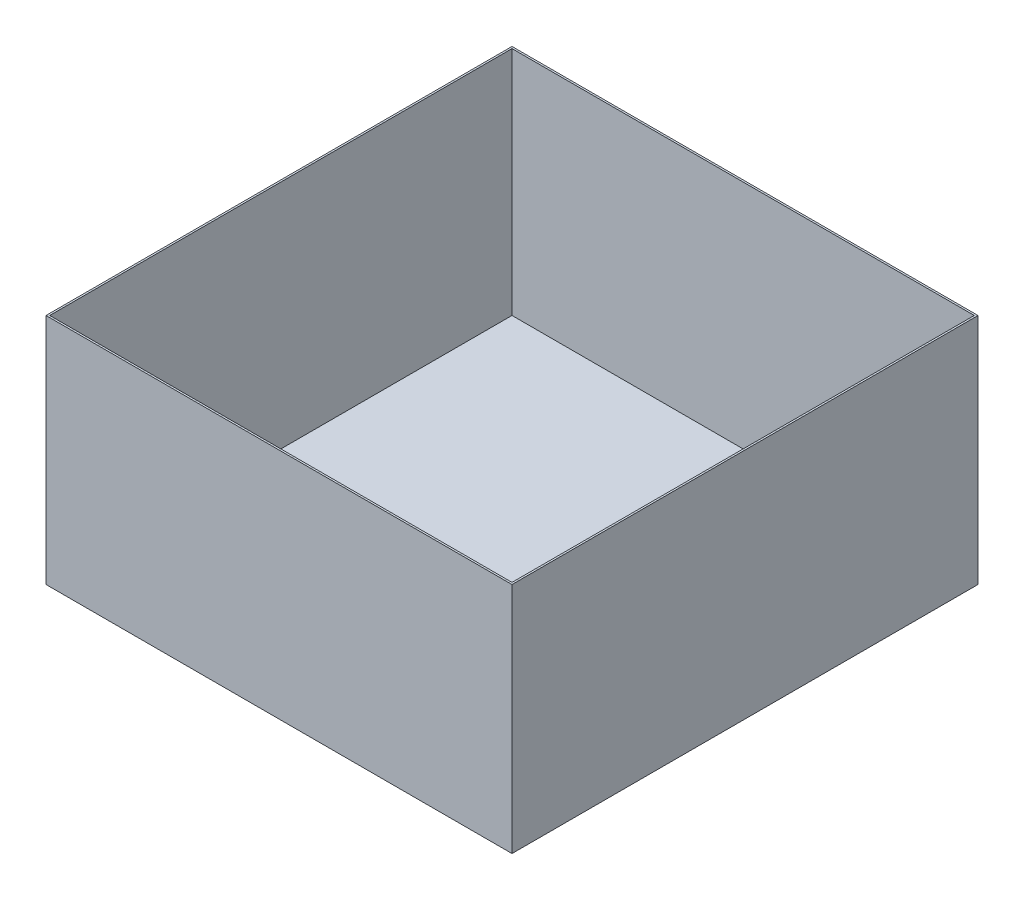
ISO-10303-21;
HEADER;
FILE_DESCRIPTION(('STEP AP214'),'2;1');
FILE_NAME('part.step','',(''),(''),'','','');
FILE_SCHEMA(('AUTOMOTIVE_DESIGN { 1 0 10303 214 1 1 1 1 }'));
ENDSEC;
DATA;
#1=APPLICATION_CONTEXT('core data for automotive mechanical design processes');
#2=APPLICATION_PROTOCOL_DEFINITION('international standard','automotive_design',2000,#1);
#3=PRODUCT_CONTEXT('',#1,'mechanical');
#4=PRODUCT('Part','Part','',(#3));
#5=PRODUCT_RELATED_PRODUCT_CATEGORY('part','',(#4));
#6=PRODUCT_DEFINITION_FORMATION('','',#4);
#7=PRODUCT_DEFINITION_CONTEXT('part definition',#1,'design');
#8=PRODUCT_DEFINITION('design','',#6,#7);
#9=PRODUCT_DEFINITION_SHAPE('','',#8);
#10=(LENGTH_UNIT() NAMED_UNIT(*) SI_UNIT(.MILLI.,.METRE.));
#11=(NAMED_UNIT(*) PLANE_ANGLE_UNIT() SI_UNIT($,.RADIAN.));
#12=(NAMED_UNIT(*) SI_UNIT($,.STERADIAN.) SOLID_ANGLE_UNIT());
#13=UNCERTAINTY_MEASURE_WITH_UNIT(LENGTH_MEASURE(1.E-05),#10,'distance_accuracy_value','');
#14=(GEOMETRIC_REPRESENTATION_CONTEXT(3) GLOBAL_UNCERTAINTY_ASSIGNED_CONTEXT((#13)) GLOBAL_UNIT_ASSIGNED_CONTEXT((#10,
#11,#12)) REPRESENTATION_CONTEXT('',''));
#15=CARTESIAN_POINT('',(0.,0.,0.));
#16=DIRECTION('',(0.,0.,1.));
#17=DIRECTION('',(1.,0.,0.));
#18=AXIS2_PLACEMENT_3D('',#15,#16,#17);
#19=CARTESIAN_POINT('',(0.,-250.,0.));
#20=DIRECTION('',(1.,0.,0.));
#21=DIRECTION('',(0.,0.,-1.));
#22=AXIS2_PLACEMENT_3D('',#19,#20,#21);
#23=PLANE('',#22);
#24=DIRECTION('',(0.,0.,-1.));
#25=VECTOR('',#24,1.);
#26=CARTESIAN_POINT('',(0.,0.,0.));
#27=LINE('',#26,#25);
#28=CARTESIAN_POINT('',(0.,0.,0.));
#29=VERTEX_POINT('',#28);
#30=CARTESIAN_POINT('',(0.,0.,-500.));
#31=VERTEX_POINT('',#30);
#32=EDGE_CURVE('E169',#29,#31,#27,.T.);
#33=ORIENTED_EDGE('',*,*,#32,.T.);
#34=DIRECTION('',(0.,1.,0.));
#35=VECTOR('',#34,1.);
#36=CARTESIAN_POINT('',(0.,-250.,-500.));
#37=LINE('',#36,#35);
#38=CARTESIAN_POINT('',(0.,-250.,-500.));
#39=VERTEX_POINT('',#38);
#40=EDGE_CURVE('E11',#39,#31,#37,.T.);
#41=ORIENTED_EDGE('',*,*,#40,.F.);
#42=DIRECTION('',(0.,0.,-1.));
#43=VECTOR('',#42,1.);
#44=CARTESIAN_POINT('',(0.,-250.,0.));
#45=LINE('',#44,#43);
#46=CARTESIAN_POINT('',(0.,-250.,0.));
#47=VERTEX_POINT('',#46);
#48=EDGE_CURVE('E156',#47,#39,#45,.T.);
#49=ORIENTED_EDGE('',*,*,#48,.F.);
#50=DIRECTION('',(0.,1.,0.));
#51=VECTOR('',#50,1.);
#52=CARTESIAN_POINT('',(0.,-250.,0.));
#53=LINE('',#52,#51);
#54=EDGE_CURVE('E63',#47,#29,#53,.T.);
#55=ORIENTED_EDGE('',*,*,#54,.T.);
#56=EDGE_LOOP('',(#33,#41,#49,#55));
#57=FACE_BOUND('',#56,.T.);
#58=ADVANCED_FACE('F39',(#57),#23,.F.);
#59=CARTESIAN_POINT('',(0.,-250.,-500.));
#60=DIRECTION('',(0.,0.,1.));
#61=DIRECTION('',(1.,0.,0.));
#62=AXIS2_PLACEMENT_3D('',#59,#60,#61);
#63=PLANE('',#62);
#64=DIRECTION('',(1.,0.,0.));
#65=VECTOR('',#64,1.);
#66=CARTESIAN_POINT('',(0.,0.,-500.));
#67=LINE('',#66,#65);
#68=CARTESIAN_POINT('',(500.,0.,-500.));
#69=VERTEX_POINT('',#68);
#70=EDGE_CURVE('E172',#31,#69,#67,.T.);
#71=ORIENTED_EDGE('',*,*,#70,.T.);
#72=DIRECTION('',(0.,1.,0.));
#73=VECTOR('',#72,1.);
#74=CARTESIAN_POINT('',(500.,-250.,-500.));
#75=LINE('',#74,#73);
#76=CARTESIAN_POINT('',(500.,-250.,-500.));
#77=VERTEX_POINT('',#76);
#78=EDGE_CURVE('E47',#77,#69,#75,.T.);
#79=ORIENTED_EDGE('',*,*,#78,.F.);
#80=DIRECTION('',(1.,0.,0.));
#81=VECTOR('',#80,1.);
#82=CARTESIAN_POINT('',(0.,-250.,-500.));
#83=LINE('',#82,#81);
#84=EDGE_CURVE('E89',#39,#77,#83,.T.);
#85=ORIENTED_EDGE('',*,*,#84,.F.);
#86=ORIENTED_EDGE('',*,*,#40,.T.);
#87=EDGE_LOOP('',(#71,#79,#85,#86));
#88=FACE_BOUND('',#87,.T.);
#89=ADVANCED_FACE('F193',(#88),#63,.F.);
#90=CARTESIAN_POINT('',(500.,-250.,0.));
#91=DIRECTION('',(1.,0.,0.));
#92=DIRECTION('',(0.,0.,-1.));
#93=AXIS2_PLACEMENT_3D('',#90,#91,#92);
#94=PLANE('',#93);
#95=DIRECTION('',(0.,0.,-1.));
#96=VECTOR('',#95,1.);
#97=CARTESIAN_POINT('',(500.,0.,0.));
#98=LINE('',#97,#96);
#99=CARTESIAN_POINT('',(500.,0.,0.));
#100=VERTEX_POINT('',#99);
#101=EDGE_CURVE('E177',#100,#69,#98,.T.);
#102=ORIENTED_EDGE('',*,*,#101,.F.);
#103=DIRECTION('',(0.,1.,0.));
#104=VECTOR('',#103,1.);
#105=CARTESIAN_POINT('',(500.,-250.,0.));
#106=LINE('',#105,#104);
#107=CARTESIAN_POINT('',(500.,-250.,0.));
#108=VERTEX_POINT('',#107);
#109=EDGE_CURVE('E186',#108,#100,#106,.T.);
#110=ORIENTED_EDGE('',*,*,#109,.F.);
#111=DIRECTION('',(0.,0.,-1.));
#112=VECTOR('',#111,1.);
#113=CARTESIAN_POINT('',(500.,-250.,0.));
#114=LINE('',#113,#112);
#115=EDGE_CURVE('E162',#108,#77,#114,.T.);
#116=ORIENTED_EDGE('',*,*,#115,.T.);
#117=ORIENTED_EDGE('',*,*,#78,.T.);
#118=EDGE_LOOP('',(#102,#110,#116,#117));
#119=FACE_BOUND('',#118,.T.);
#120=ADVANCED_FACE('F191',(#119),#94,.T.);
#121=CARTESIAN_POINT('',(0.,-250.,0.));
#122=DIRECTION('',(0.,0.,1.));
#123=DIRECTION('',(1.,0.,0.));
#124=AXIS2_PLACEMENT_3D('',#121,#122,#123);
#125=PLANE('',#124);
#126=DIRECTION('',(1.,0.,0.));
#127=VECTOR('',#126,1.);
#128=CARTESIAN_POINT('',(0.,0.,0.));
#129=LINE('',#128,#127);
#130=EDGE_CURVE('E159',#29,#100,#129,.T.);
#131=ORIENTED_EDGE('',*,*,#130,.F.);
#132=ORIENTED_EDGE('',*,*,#54,.F.);
#133=DIRECTION('',(1.,0.,0.));
#134=VECTOR('',#133,1.);
#135=CARTESIAN_POINT('',(0.,-250.,0.));
#136=LINE('',#135,#134);
#137=EDGE_CURVE('E166',#47,#108,#136,.T.);
#138=ORIENTED_EDGE('',*,*,#137,.T.);
#139=ORIENTED_EDGE('',*,*,#109,.T.);
#140=EDGE_LOOP('',(#131,#132,#138,#139));
#141=FACE_BOUND('',#140,.T.);
#142=ADVANCED_FACE('F197',(#141),#125,.T.);
#143=CARTESIAN_POINT('',(0.,-250.,0.));
#144=DIRECTION('',(0.,-1.,0.));
#145=DIRECTION('',(0.,0.,-1.));
#146=AXIS2_PLACEMENT_3D('',#143,#144,#145);
#147=PLANE('',#146);
#148=ORIENTED_EDGE('',*,*,#48,.T.);
#149=ORIENTED_EDGE('',*,*,#84,.T.);
#150=ORIENTED_EDGE('',*,*,#115,.F.);
#151=ORIENTED_EDGE('',*,*,#137,.F.);
#152=EDGE_LOOP('',(#148,#149,#150,#151));
#153=FACE_BOUND('',#152,.T.);
#154=ADVANCED_FACE('F200',(#153),#147,.T.);
#155=CARTESIAN_POINT('',(0.,0.,0.));
#156=DIRECTION('',(0.,-1.,0.));
#157=DIRECTION('',(0.,0.,-1.));
#158=AXIS2_PLACEMENT_3D('',#155,#156,#157);
#159=PLANE('',#158);
#160=DIRECTION('',(1.,0.,0.));
#161=VECTOR('',#160,1.);
#162=CARTESIAN_POINT('',(0.,0.,-2.));
#163=LINE('',#162,#161);
#164=CARTESIAN_POINT('',(2.,0.,-2.));
#165=VERTEX_POINT('',#164);
#166=CARTESIAN_POINT('',(498.,0.,-2.));
#167=VERTEX_POINT('',#166);
#168=EDGE_CURVE('E135',#165,#167,#163,.T.);
#169=ORIENTED_EDGE('',*,*,#168,.F.);
#170=DIRECTION('',(0.,0.,-1.));
#171=VECTOR('',#170,1.);
#172=CARTESIAN_POINT('',(2.,0.,0.));
#173=LINE('',#172,#171);
#174=CARTESIAN_POINT('',(2.,0.,-498.));
#175=VERTEX_POINT('',#174);
#176=EDGE_CURVE('E120',#165,#175,#173,.T.);
#177=ORIENTED_EDGE('',*,*,#176,.T.);
#178=DIRECTION('',(1.,0.,0.));
#179=VECTOR('',#178,1.);
#180=CARTESIAN_POINT('',(0.,0.,-498.));
#181=LINE('',#180,#179);
#182=CARTESIAN_POINT('',(498.,0.,-498.));
#183=VERTEX_POINT('',#182);
#184=EDGE_CURVE('E148',#175,#183,#181,.T.);
#185=ORIENTED_EDGE('',*,*,#184,.T.);
#186=DIRECTION('',(0.,0.,-1.));
#187=VECTOR('',#186,1.);
#188=CARTESIAN_POINT('',(498.,0.,0.));
#189=LINE('',#188,#187);
#190=EDGE_CURVE('E54',#167,#183,#189,.T.);
#191=ORIENTED_EDGE('',*,*,#190,.F.);
#192=EDGE_LOOP('',(#169,#177,#185,#191));
#193=FACE_BOUND('',#192,.T.);
#194=ORIENTED_EDGE('',*,*,#32,.F.);
#195=ORIENTED_EDGE('',*,*,#130,.T.);
#196=ORIENTED_EDGE('',*,*,#101,.T.);
#197=ORIENTED_EDGE('',*,*,#70,.F.);
#198=EDGE_LOOP('',(#194,#195,#196,#197));
#199=FACE_BOUND('',#198,.T.);
#200=ADVANCED_FACE('F196',(#193,#199),#159,.F.);
#201=CARTESIAN_POINT('',(2.,-250.,0.));
#202=DIRECTION('',(1.,0.,0.));
#203=DIRECTION('',(0.,0.,-1.));
#204=AXIS2_PLACEMENT_3D('',#201,#202,#203);
#205=PLANE('',#204);
#206=ORIENTED_EDGE('',*,*,#176,.F.);
#207=DIRECTION('',(0.,1.,0.));
#208=VECTOR('',#207,1.);
#209=CARTESIAN_POINT('',(2.,-250.,-2.));
#210=LINE('',#209,#208);
#211=CARTESIAN_POINT('',(2.,-248.,-2.));
#212=VERTEX_POINT('',#211);
#213=EDGE_CURVE('E113',#212,#165,#210,.T.);
#214=ORIENTED_EDGE('',*,*,#213,.F.);
#215=DIRECTION('',(0.,0.,-1.));
#216=VECTOR('',#215,1.);
#217=CARTESIAN_POINT('',(2.,-248.,0.));
#218=LINE('',#217,#216);
#219=CARTESIAN_POINT('',(2.,-248.,-498.));
#220=VERTEX_POINT('',#219);
#221=EDGE_CURVE('E117',#212,#220,#218,.T.);
#222=ORIENTED_EDGE('',*,*,#221,.T.);
#223=DIRECTION('',(0.,1.,0.));
#224=VECTOR('',#223,1.);
#225=CARTESIAN_POINT('',(2.,-250.,-498.));
#226=LINE('',#225,#224);
#227=EDGE_CURVE('E173',#220,#175,#226,.T.);
#228=ORIENTED_EDGE('',*,*,#227,.T.);
#229=EDGE_LOOP('',(#206,#214,#222,#228));
#230=FACE_BOUND('',#229,.T.);
#231=ADVANCED_FACE('F115',(#230),#205,.T.);
#232=CARTESIAN_POINT('',(0.,-250.,-498.));
#233=DIRECTION('',(0.,0.,1.));
#234=DIRECTION('',(1.,0.,0.));
#235=AXIS2_PLACEMENT_3D('',#232,#233,#234);
#236=PLANE('',#235);
#237=ORIENTED_EDGE('',*,*,#184,.F.);
#238=ORIENTED_EDGE('',*,*,#227,.F.);
#239=DIRECTION('',(1.,0.,0.));
#240=VECTOR('',#239,1.);
#241=CARTESIAN_POINT('',(0.,-248.,-498.));
#242=LINE('',#241,#240);
#243=CARTESIAN_POINT('',(498.,-248.,-498.));
#244=VERTEX_POINT('',#243);
#245=EDGE_CURVE('E133',#220,#244,#242,.T.);
#246=ORIENTED_EDGE('',*,*,#245,.T.);
#247=DIRECTION('',(0.,1.,0.));
#248=VECTOR('',#247,1.);
#249=CARTESIAN_POINT('',(498.,-250.,-498.));
#250=LINE('',#249,#248);
#251=EDGE_CURVE('E291',#244,#183,#250,.T.);
#252=ORIENTED_EDGE('',*,*,#251,.T.);
#253=EDGE_LOOP('',(#237,#238,#246,#252));
#254=FACE_BOUND('',#253,.T.);
#255=ADVANCED_FACE('F224',(#254),#236,.T.);
#256=CARTESIAN_POINT('',(498.,-250.,0.));
#257=DIRECTION('',(1.,0.,0.));
#258=DIRECTION('',(0.,0.,-1.));
#259=AXIS2_PLACEMENT_3D('',#256,#257,#258);
#260=PLANE('',#259);
#261=ORIENTED_EDGE('',*,*,#190,.T.);
#262=ORIENTED_EDGE('',*,*,#251,.F.);
#263=DIRECTION('',(0.,0.,-1.));
#264=VECTOR('',#263,1.);
#265=CARTESIAN_POINT('',(498.,-248.,0.));
#266=LINE('',#265,#264);
#267=CARTESIAN_POINT('',(498.,-248.,-2.));
#268=VERTEX_POINT('',#267);
#269=EDGE_CURVE('E140',#268,#244,#266,.T.);
#270=ORIENTED_EDGE('',*,*,#269,.F.);
#271=DIRECTION('',(0.,1.,0.));
#272=VECTOR('',#271,1.);
#273=CARTESIAN_POINT('',(498.,-250.,-2.));
#274=LINE('',#273,#272);
#275=EDGE_CURVE('E126',#268,#167,#274,.T.);
#276=ORIENTED_EDGE('',*,*,#275,.T.);
#277=EDGE_LOOP('',(#261,#262,#270,#276));
#278=FACE_BOUND('',#277,.T.);
#279=ADVANCED_FACE('F221',(#278),#260,.F.);
#280=CARTESIAN_POINT('',(0.,-250.,-2.));
#281=DIRECTION('',(0.,0.,1.));
#282=DIRECTION('',(1.,0.,0.));
#283=AXIS2_PLACEMENT_3D('',#280,#281,#282);
#284=PLANE('',#283);
#285=ORIENTED_EDGE('',*,*,#168,.T.);
#286=ORIENTED_EDGE('',*,*,#275,.F.);
#287=DIRECTION('',(1.,0.,0.));
#288=VECTOR('',#287,1.);
#289=CARTESIAN_POINT('',(0.,-248.,-2.));
#290=LINE('',#289,#288);
#291=EDGE_CURVE('E127',#212,#268,#290,.T.);
#292=ORIENTED_EDGE('',*,*,#291,.F.);
#293=ORIENTED_EDGE('',*,*,#213,.T.);
#294=EDGE_LOOP('',(#285,#286,#292,#293));
#295=FACE_BOUND('',#294,.T.);
#296=ADVANCED_FACE('F137',(#295),#284,.F.);
#297=CARTESIAN_POINT('',(0.,-248.,0.));
#298=DIRECTION('',(0.,-1.,0.));
#299=DIRECTION('',(0.,0.,-1.));
#300=AXIS2_PLACEMENT_3D('',#297,#298,#299);
#301=PLANE('',#300);
#302=ORIENTED_EDGE('',*,*,#221,.F.);
#303=ORIENTED_EDGE('',*,*,#291,.T.);
#304=ORIENTED_EDGE('',*,*,#269,.T.);
#305=ORIENTED_EDGE('',*,*,#245,.F.);
#306=EDGE_LOOP('',(#302,#303,#304,#305));
#307=FACE_BOUND('',#306,.T.);
#308=ADVANCED_FACE('F131',(#307),#301,.F.);
#309=CLOSED_SHELL('',(#58,#89,#120,#142,#154,#200,#231,#255,#279,#296,#308));
#310=MANIFOLD_SOLID_BREP('B2',#309);
#311=ADVANCED_BREP_SHAPE_REPRESENTATION('',(#18,#310),#14);
#312=SHAPE_DEFINITION_REPRESENTATION(#9,#311);
ENDSEC;
END-ISO-10303-21;
